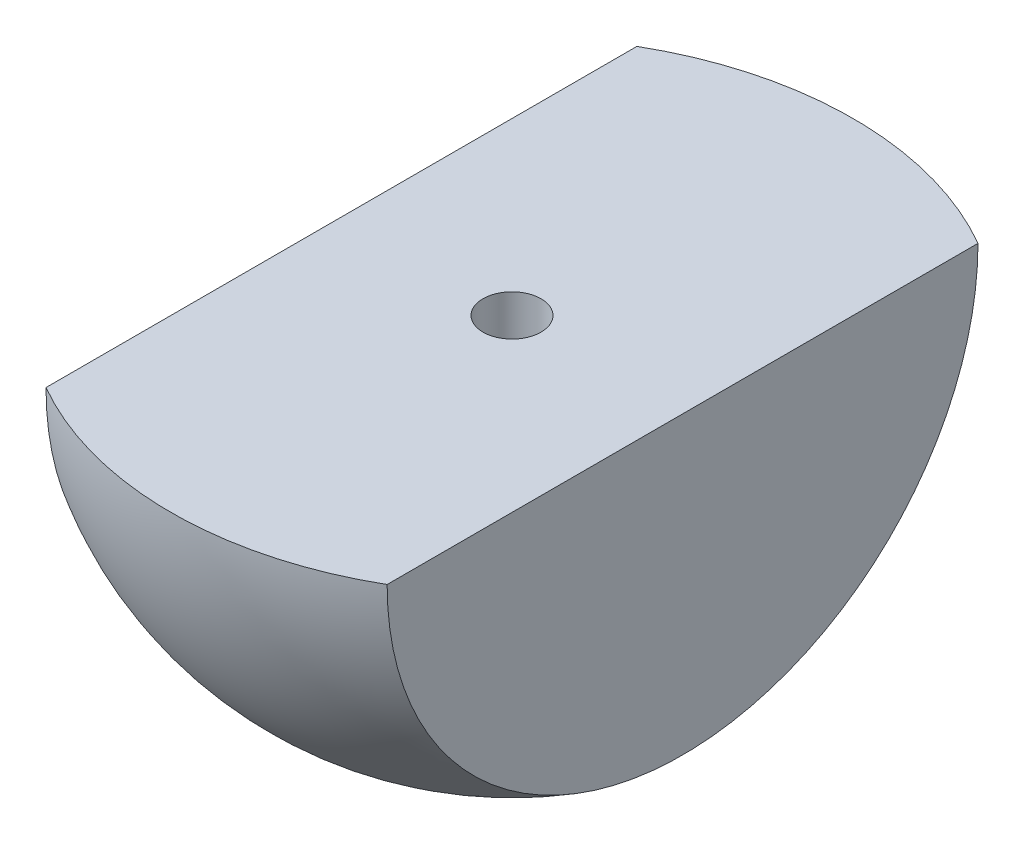
ISO-10303-21;
HEADER;
FILE_DESCRIPTION(('STEP AP214'),'2;1');
FILE_NAME('part.step','',(''),(''),'','','');
FILE_SCHEMA(('AUTOMOTIVE_DESIGN { 1 0 10303 214 1 1 1 1 }'));
ENDSEC;
DATA;
#1=APPLICATION_CONTEXT('core data for automotive mechanical design processes');
#2=APPLICATION_PROTOCOL_DEFINITION('international standard','automotive_design',2000,#1);
#3=PRODUCT_CONTEXT('',#1,'mechanical');
#4=PRODUCT('Part','Part','',(#3));
#5=PRODUCT_RELATED_PRODUCT_CATEGORY('part','',(#4));
#6=PRODUCT_DEFINITION_FORMATION('','',#4);
#7=PRODUCT_DEFINITION_CONTEXT('part definition',#1,'design');
#8=PRODUCT_DEFINITION('design','',#6,#7);
#9=PRODUCT_DEFINITION_SHAPE('','',#8);
#10=(LENGTH_UNIT() NAMED_UNIT(*) SI_UNIT(.MILLI.,.METRE.));
#11=(NAMED_UNIT(*) PLANE_ANGLE_UNIT() SI_UNIT($,.RADIAN.));
#12=(NAMED_UNIT(*) SI_UNIT($,.STERADIAN.) SOLID_ANGLE_UNIT());
#13=UNCERTAINTY_MEASURE_WITH_UNIT(LENGTH_MEASURE(1.E-05),#10,'distance_accuracy_value','');
#14=(GEOMETRIC_REPRESENTATION_CONTEXT(3) GLOBAL_UNCERTAINTY_ASSIGNED_CONTEXT((#13)) GLOBAL_UNIT_ASSIGNED_CONTEXT((#10,
#11,#12)) REPRESENTATION_CONTEXT('',''));
#15=CARTESIAN_POINT('',(0.,0.,0.));
#16=DIRECTION('',(0.,0.,1.));
#17=DIRECTION('',(1.,0.,0.));
#18=AXIS2_PLACEMENT_3D('',#15,#16,#17);
#19=CARTESIAN_POINT('',(0.,0.,0.));
#20=DIRECTION('',(1.,0.,0.));
#21=DIRECTION('',(0.,0.,-1.));
#22=AXIS2_PLACEMENT_3D('',#19,#20,#21);
#23=SPHERICAL_SURFACE('',#22,20.);
#24=CARTESIAN_POINT('',(0.,-19.7341708718659,0.));
#25=DIRECTION('',(0.,1.,0.));
#26=DIRECTION('',(0.,0.,1.));
#27=AXIS2_PLACEMENT_3D('',#24,#25,#26);
#28=CIRCLE('',#27,3.25);
#29=CARTESIAN_POINT('',(0.,-19.7341708718659,3.25));
#30=VERTEX_POINT('',#29);
#31=EDGE_CURVE('E37',#30,#30,#28,.F.);
#32=ORIENTED_EDGE('',*,*,#31,.F.);
#33=EDGE_LOOP('',(#32));
#34=FACE_BOUND('',#33,.T.);
#35=CARTESIAN_POINT('',(-10.,0.,0.));
#36=DIRECTION('',(1.,0.,0.));
#37=DIRECTION('',(0.,0.,-1.));
#38=AXIS2_PLACEMENT_3D('',#35,#36,#37);
#39=CIRCLE('',#38,17.3205080756888);
#40=CARTESIAN_POINT('',(-10.,-1.20948461451098E-13,-17.3205080756888));
#41=VERTEX_POINT('',#40);
#42=CARTESIAN_POINT('',(-10.,1.20948461451098E-13,17.3205080756888));
#43=VERTEX_POINT('',#42);
#44=EDGE_CURVE('E48',#41,#43,#39,.F.);
#45=ORIENTED_EDGE('',*,*,#44,.F.);
#46=CARTESIAN_POINT('',(0.,0.,0.));
#47=DIRECTION('',(0.,-1.,0.));
#48=DIRECTION('',(0.,0.,-1.));
#49=AXIS2_PLACEMENT_3D('',#46,#47,#48);
#50=CIRCLE('',#49,20.);
#51=CARTESIAN_POINT('',(10.,-1.20948461451098E-13,-17.3205080756888));
#52=VERTEX_POINT('',#51);
#53=EDGE_CURVE('E68',#41,#52,#50,.T.);
#54=ORIENTED_EDGE('',*,*,#53,.T.);
#55=CARTESIAN_POINT('',(10.,0.,0.));
#56=DIRECTION('',(-1.,0.,0.));
#57=DIRECTION('',(0.,0.,1.));
#58=AXIS2_PLACEMENT_3D('',#55,#56,#57);
#59=CIRCLE('',#58,17.3205080756888);
#60=CARTESIAN_POINT('',(10.,1.20948461451098E-13,17.3205080756888));
#61=VERTEX_POINT('',#60);
#62=EDGE_CURVE('E54',#61,#52,#59,.F.);
#63=ORIENTED_EDGE('',*,*,#62,.F.);
#64=EDGE_CURVE('E64',#61,#43,#50,.T.);
#65=ORIENTED_EDGE('',*,*,#64,.T.);
#66=EDGE_LOOP('',(#45,#54,#63,#65));
#67=FACE_BOUND('',#66,.T.);
#68=ADVANCED_FACE('F34',(#34,#67),#23,.T.);
#69=CARTESIAN_POINT('',(0.,0.,0.));
#70=DIRECTION('',(0.,-1.,0.));
#71=DIRECTION('',(0.,0.,-1.));
#72=AXIS2_PLACEMENT_3D('',#69,#70,#71);
#73=PLANE('',#72);
#74=CARTESIAN_POINT('',(0.,1.21430643318376E-13,0.));
#75=DIRECTION('',(0.,-1.,0.));
#76=DIRECTION('',(0.,0.,-1.));
#77=AXIS2_PLACEMENT_3D('',#74,#75,#76);
#78=CIRCLE('',#77,1.7);
#79=CARTESIAN_POINT('',(0.,1.21430643318376E-13,-1.7));
#80=VERTEX_POINT('',#79);
#81=EDGE_CURVE('E74',#80,#80,#78,.T.);
#82=ORIENTED_EDGE('',*,*,#81,.T.);
#83=EDGE_LOOP('',(#82));
#84=FACE_BOUND('',#83,.T.);
#85=ORIENTED_EDGE('',*,*,#53,.F.);
#86=DIRECTION('',(0.,0.,1.));
#87=VECTOR('',#86,1.);
#88=CARTESIAN_POINT('',(-10.,0.,0.));
#89=LINE('',#88,#87);
#90=EDGE_CURVE('E11',#41,#43,#89,.T.);
#91=ORIENTED_EDGE('',*,*,#90,.T.);
#92=ORIENTED_EDGE('',*,*,#64,.F.);
#93=DIRECTION('',(0.,0.,-1.));
#94=VECTOR('',#93,1.);
#95=CARTESIAN_POINT('',(10.,0.,0.));
#96=LINE('',#95,#94);
#97=EDGE_CURVE('E42',#61,#52,#96,.T.);
#98=ORIENTED_EDGE('',*,*,#97,.T.);
#99=EDGE_LOOP('',(#85,#91,#92,#98));
#100=FACE_BOUND('',#99,.T.);
#101=ADVANCED_FACE('F70',(#84,#100),#73,.F.);
#102=CARTESIAN_POINT('',(10.,-20.0000000000003,-22.4999999999999));
#103=DIRECTION('',(-1.,0.,0.));
#104=DIRECTION('',(0.,0.,1.));
#105=AXIS2_PLACEMENT_3D('',#102,#103,#104);
#106=PLANE('',#105);
#107=ORIENTED_EDGE('',*,*,#62,.T.);
#108=ORIENTED_EDGE('',*,*,#97,.F.);
#109=EDGE_LOOP('',(#107,#108));
#110=FACE_BOUND('',#109,.T.);
#111=ADVANCED_FACE('F59',(#110),#106,.F.);
#112=CARTESIAN_POINT('',(-10.,-20.0000000000003,-22.4999999999999));
#113=DIRECTION('',(1.,0.,0.));
#114=DIRECTION('',(0.,0.,-1.));
#115=AXIS2_PLACEMENT_3D('',#112,#113,#114);
#116=PLANE('',#115);
#117=ORIENTED_EDGE('',*,*,#44,.T.);
#118=ORIENTED_EDGE('',*,*,#90,.F.);
#119=EDGE_LOOP('',(#117,#118));
#120=FACE_BOUND('',#119,.T.);
#121=ADVANCED_FACE('F107',(#120),#116,.F.);
#122=CARTESIAN_POINT('',(0.,-20.,0.));
#123=DIRECTION('',(0.,-1.,0.));
#124=DIRECTION('',(0.,0.,-1.));
#125=AXIS2_PLACEMENT_3D('',#122,#123,#124);
#126=CYLINDRICAL_SURFACE('',#125,1.7);
#127=ORIENTED_EDGE('',*,*,#81,.F.);
#128=EDGE_LOOP('',(#127));
#129=FACE_BOUND('',#128,.T.);
#130=CARTESIAN_POINT('',(0.,-16.,0.));
#131=DIRECTION('',(0.,-1.,0.));
#132=DIRECTION('',(0.,0.,-1.));
#133=AXIS2_PLACEMENT_3D('',#130,#131,#132);
#134=CIRCLE('',#133,1.7);
#135=CARTESIAN_POINT('',(0.,-16.,-1.7));
#136=VERTEX_POINT('',#135);
#137=EDGE_CURVE('E77',#136,#136,#134,.T.);
#138=ORIENTED_EDGE('',*,*,#137,.T.);
#139=EDGE_LOOP('',(#138));
#140=FACE_BOUND('',#139,.T.);
#141=ADVANCED_FACE('F93',(#129,#140),#126,.F.);
#142=CARTESIAN_POINT('',(1.7,-16.,0.));
#143=DIRECTION('',(0.,1.,0.));
#144=DIRECTION('',(0.,0.,1.));
#145=AXIS2_PLACEMENT_3D('',#142,#143,#144);
#146=PLANE('',#145);
#147=ORIENTED_EDGE('',*,*,#137,.F.);
#148=EDGE_LOOP('',(#147));
#149=FACE_BOUND('',#148,.T.);
#150=CARTESIAN_POINT('',(0.,-16.,0.));
#151=DIRECTION('',(0.,-1.,0.));
#152=DIRECTION('',(0.,0.,-1.));
#153=AXIS2_PLACEMENT_3D('',#150,#151,#152);
#154=CIRCLE('',#153,3.25);
#155=CARTESIAN_POINT('',(0.,-16.,-3.25));
#156=VERTEX_POINT('',#155);
#157=EDGE_CURVE('E80',#156,#156,#154,.T.);
#158=ORIENTED_EDGE('',*,*,#157,.T.);
#159=EDGE_LOOP('',(#158));
#160=FACE_BOUND('',#159,.T.);
#161=ADVANCED_FACE('F84',(#149,#160),#146,.F.);
#162=CARTESIAN_POINT('',(0.,-20.,0.));
#163=DIRECTION('',(0.,-1.,0.));
#164=DIRECTION('',(0.,0.,-1.));
#165=AXIS2_PLACEMENT_3D('',#162,#163,#164);
#166=CYLINDRICAL_SURFACE('',#165,3.25);
#167=ORIENTED_EDGE('',*,*,#31,.T.);
#168=EDGE_LOOP('',(#167));
#169=FACE_BOUND('',#168,.T.);
#170=ORIENTED_EDGE('',*,*,#157,.F.);
#171=EDGE_LOOP('',(#170));
#172=FACE_BOUND('',#171,.T.);
#173=ADVANCED_FACE('F86',(#169,#172),#166,.F.);
#174=CLOSED_SHELL('',(#68,#101,#111,#121,#141,#161,#173));
#175=MANIFOLD_SOLID_BREP('B2',#174);
#176=ADVANCED_BREP_SHAPE_REPRESENTATION('',(#18,#175),#14);
#177=SHAPE_DEFINITION_REPRESENTATION(#9,#176);
ENDSEC;
END-ISO-10303-21;
